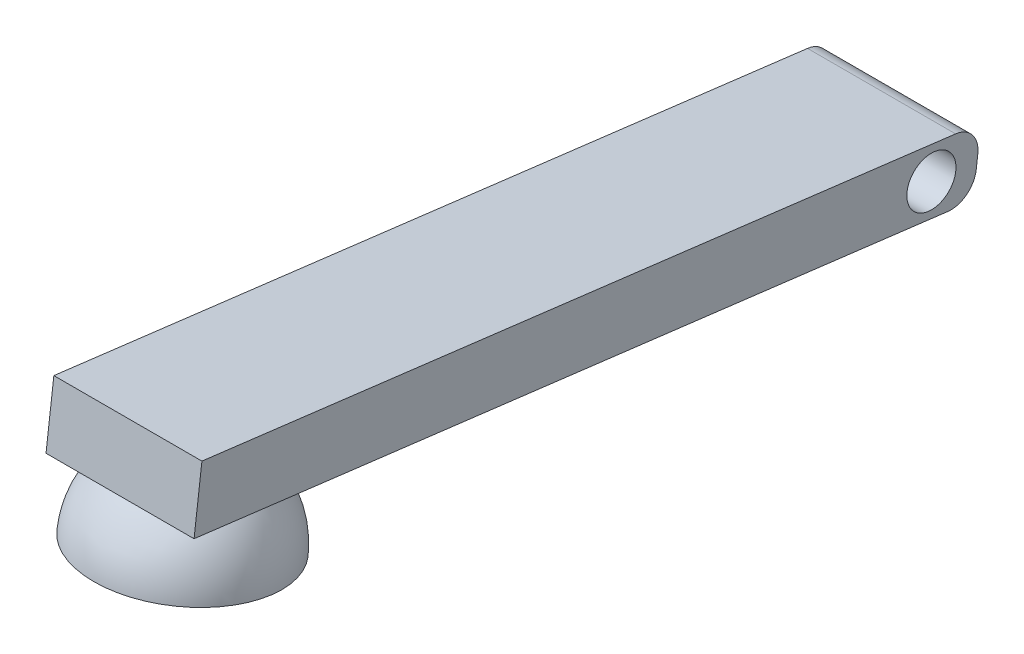
ISO-10303-21;
HEADER;
FILE_DESCRIPTION(('STEP AP214'),'2;1');
FILE_NAME('part.step','',(''),(''),'','','');
FILE_SCHEMA(('AUTOMOTIVE_DESIGN { 1 0 10303 214 1 1 1 1 }'));
ENDSEC;
DATA;
#1=APPLICATION_CONTEXT('core data for automotive mechanical design processes');
#2=APPLICATION_PROTOCOL_DEFINITION('international standard','automotive_design',2000,#1);
#3=PRODUCT_CONTEXT('',#1,'mechanical');
#4=PRODUCT('Part','Part','',(#3));
#5=PRODUCT_RELATED_PRODUCT_CATEGORY('part','',(#4));
#6=PRODUCT_DEFINITION_FORMATION('','',#4);
#7=PRODUCT_DEFINITION_CONTEXT('part definition',#1,'design');
#8=PRODUCT_DEFINITION('design','',#6,#7);
#9=PRODUCT_DEFINITION_SHAPE('','',#8);
#10=(LENGTH_UNIT() NAMED_UNIT(*) SI_UNIT(.MILLI.,.METRE.));
#11=(NAMED_UNIT(*) PLANE_ANGLE_UNIT() SI_UNIT($,.RADIAN.));
#12=(NAMED_UNIT(*) SI_UNIT($,.STERADIAN.) SOLID_ANGLE_UNIT());
#13=UNCERTAINTY_MEASURE_WITH_UNIT(LENGTH_MEASURE(1.E-05),#10,'distance_accuracy_value','');
#14=(GEOMETRIC_REPRESENTATION_CONTEXT(3) GLOBAL_UNCERTAINTY_ASSIGNED_CONTEXT((#13)) GLOBAL_UNIT_ASSIGNED_CONTEXT((#10,
#11,#12)) REPRESENTATION_CONTEXT('',''));
#15=CARTESIAN_POINT('',(0.,0.,0.));
#16=DIRECTION('',(0.,0.,1.));
#17=DIRECTION('',(1.,0.,0.));
#18=AXIS2_PLACEMENT_3D('',#15,#16,#17);
#19=CARTESIAN_POINT('',(-87.5137541739266,3.5780718624892,28.8524545178739));
#20=DIRECTION('',(0.,-0.123069991640094,-0.992397993326119));
#21=DIRECTION('',(0.,0.992397993326119,-0.123069991640094));
#22=AXIS2_PLACEMENT_3D('',#19,#20,#21);
#23=PLANE('',#22);
#24=DIRECTION('',(0.,0.992397993326119,-0.123069991640094));
#25=VECTOR('',#24,1.);
#26=CARTESIAN_POINT('',(-7.366,3.5780718624892,28.8524545178739));
#27=LINE('',#26,#25);
#28=CARTESIAN_POINT('',(-7.366,38.9188420664606,24.4697488667068));
#29=VERTEX_POINT('',#28);
#30=CARTESIAN_POINT('',(-7.366,45.2205693240815,23.6882544197922));
#31=VERTEX_POINT('',#30);
#32=EDGE_CURVE('E134',#29,#31,#27,.T.);
#33=ORIENTED_EDGE('',*,*,#32,.F.);
#34=DIRECTION('',(1.,0.,0.));
#35=VECTOR('',#34,1.);
#36=CARTESIAN_POINT('',(-87.5137541739266,38.9188420664606,24.4697488667068));
#37=LINE('',#36,#35);
#38=CARTESIAN_POINT('',(7.366,38.9188420664606,24.4697488667068));
#39=VERTEX_POINT('',#38);
#40=EDGE_CURVE('E104',#29,#39,#37,.T.);
#41=ORIENTED_EDGE('',*,*,#40,.T.);
#42=DIRECTION('',(0.,0.992397993326119,-0.123069991640094));
#43=VECTOR('',#42,1.);
#44=CARTESIAN_POINT('',(7.366,3.5780718624892,28.8524545178739));
#45=LINE('',#44,#43);
#46=CARTESIAN_POINT('',(7.366,45.2205693240815,23.6882544197922));
#47=VERTEX_POINT('',#46);
#48=EDGE_CURVE('E108',#39,#47,#45,.T.);
#49=ORIENTED_EDGE('',*,*,#48,.T.);
#50=DIRECTION('',(1.,0.,0.));
#51=VECTOR('',#50,1.);
#52=CARTESIAN_POINT('',(-87.5137541739266,45.2205693240815,23.6882544197922));
#53=LINE('',#52,#51);
#54=EDGE_CURVE('E123',#31,#47,#53,.T.);
#55=ORIENTED_EDGE('',*,*,#54,.F.);
#56=EDGE_LOOP('',(#33,#41,#49,#55));
#57=FACE_BOUND('',#56,.T.);
#58=ADVANCED_FACE('F39',(#57),#23,.F.);
#59=CARTESIAN_POINT('',(-87.5137541739266,41.6424974615923,-5.16420009808172));
#60=DIRECTION('',(0.,-0.992397993326118,0.123069991640095));
#61=DIRECTION('',(0.,-0.123069991640095,-0.992397993326119));
#62=AXIS2_PLACEMENT_3D('',#59,#60,#61);
#63=PLANE('',#62);
#64=DIRECTION('',(0.,-0.123069991640095,-0.992397993326119));
#65=VECTOR('',#64,1.);
#66=CARTESIAN_POINT('',(7.366,41.6424974615923,-5.16420009808172));
#67=LINE('',#66,#65);
#68=CARTESIAN_POINT('',(7.366,35.9207854057977,-51.302299945896));
#69=VERTEX_POINT('',#68);
#70=EDGE_CURVE('E121',#47,#69,#67,.T.);
#71=ORIENTED_EDGE('',*,*,#70,.T.);
#72=DIRECTION('',(1.,0.,0.));
#73=VECTOR('',#72,1.);
#74=CARTESIAN_POINT('',(-87.5137541739266,35.9207854057977,-51.302299945896));
#75=LINE('',#74,#73);
#76=CARTESIAN_POINT('',(-7.366,35.9207854057977,-51.302299945896));
#77=VERTEX_POINT('',#76);
#78=EDGE_CURVE('E11',#69,#77,#75,.F.);
#79=ORIENTED_EDGE('',*,*,#78,.T.);
#80=DIRECTION('',(0.,-0.123069991640095,-0.992397993326119));
#81=VECTOR('',#80,1.);
#82=CARTESIAN_POINT('',(-7.366,41.6424974615923,-5.16420009808172));
#83=LINE('',#82,#81);
#84=EDGE_CURVE('E132',#31,#77,#83,.T.);
#85=ORIENTED_EDGE('',*,*,#84,.F.);
#86=ORIENTED_EDGE('',*,*,#54,.T.);
#87=EDGE_LOOP('',(#71,#79,#85,#86));
#88=FACE_BOUND('',#87,.T.);
#89=ADVANCED_FACE('F175',(#88),#63,.F.);
#90=CARTESIAN_POINT('',(-87.5137541739266,-6.03430983456038,-48.6587907508626));
#91=DIRECTION('',(0.,0.123069991640095,0.992397993326118));
#92=DIRECTION('',(0.,-0.992397993326119,0.123069991640095));
#93=AXIS2_PLACEMENT_3D('',#90,#91,#92);
#94=PLANE('',#93);
#95=DIRECTION('',(0.,-0.992397993326119,0.123069991640095));
#96=VECTOR('',#95,1.);
#97=CARTESIAN_POINT('',(7.366,-6.03430983456038,-48.6587907508626));
#98=LINE('',#97,#96);
#99=CARTESIAN_POINT('',(7.366,33.0874967239835,-53.5103930701785));
#100=VERTEX_POINT('',#99);
#101=CARTESIAN_POINT('',(7.366,31.8271512724594,-53.3540941807956));
#102=VERTEX_POINT('',#101);
#103=EDGE_CURVE('E119',#100,#102,#98,.T.);
#104=ORIENTED_EDGE('',*,*,#103,.T.);
#105=DIRECTION('',(1.,0.,0.));
#106=VECTOR('',#105,1.);
#107=CARTESIAN_POINT('',(-87.5137541739266,31.8271512724594,-53.3540941807956));
#108=LINE('',#107,#106);
#109=CARTESIAN_POINT('',(-7.366,31.8271512724594,-53.3540941807956));
#110=VERTEX_POINT('',#109);
#111=EDGE_CURVE('E60',#102,#110,#108,.F.);
#112=ORIENTED_EDGE('',*,*,#111,.T.);
#113=DIRECTION('',(0.,-0.992397993326119,0.123069991640095));
#114=VECTOR('',#113,1.);
#115=CARTESIAN_POINT('',(-7.366,-6.03430983456038,-48.6587907508626));
#116=LINE('',#115,#114);
#117=CARTESIAN_POINT('',(-7.366,33.0874967239835,-53.5103930701785));
#118=VERTEX_POINT('',#117);
#119=EDGE_CURVE('E129',#118,#110,#116,.T.);
#120=ORIENTED_EDGE('',*,*,#119,.F.);
#121=DIRECTION('',(1.,0.,0.));
#122=VECTOR('',#121,1.);
#123=CARTESIAN_POINT('',(-87.5137541739266,33.0874967239835,-53.5103930701785));
#124=LINE('',#123,#122);
#125=EDGE_CURVE('E148',#118,#100,#124,.T.);
#126=ORIENTED_EDGE('',*,*,#125,.T.);
#127=EDGE_LOOP('',(#104,#112,#120,#126));
#128=FACE_BOUND('',#127,.T.);
#129=ADVANCED_FACE('F170',(#128),#94,.F.);
#130=CARTESIAN_POINT('',(-87.5137541739266,35.3407702039715,-4.38270565116708));
#131=DIRECTION('',(0.,0.992397993326119,-0.123069991640094));
#132=DIRECTION('',(0.,0.123069991640094,0.992397993326119));
#133=AXIS2_PLACEMENT_3D('',#130,#131,#132);
#134=PLANE('',#133);
#135=CARTESIAN_POINT('',(0.,38.0517272576209,17.4776057389776));
#136=DIRECTION('',(0.,0.992397993326119,-0.123069991640094));
#137=DIRECTION('',(0.,0.123069991640094,0.992397993326119));
#138=AXIS2_PLACEMENT_3D('',#135,#136,#137);
#139=CIRCLE('',#138,6.22170394666916);
#140=CARTESIAN_POINT('',(0.,38.8174323103246,23.6520122507213));
#141=VERTEX_POINT('',#140);
#142=EDGE_CURVE('E131',#141,#141,#139,.F.);
#143=ORIENTED_EDGE('',*,*,#142,.F.);
#144=EDGE_LOOP('',(#143));
#145=FACE_BOUND('',#144,.T.);
#146=DIRECTION('',(0.,0.123069991640094,0.992397993326119));
#147=VECTOR('',#146,1.);
#148=CARTESIAN_POINT('',(-7.366,35.3407702039715,-4.38270565116708));
#149=LINE('',#148,#147);
#150=CARTESIAN_POINT('',(-7.366,29.6190581481769,-50.5208054989814));
#151=VERTEX_POINT('',#150);
#152=EDGE_CURVE('E128',#151,#29,#149,.T.);
#153=ORIENTED_EDGE('',*,*,#152,.F.);
#154=DIRECTION('',(1.,0.,0.));
#155=VECTOR('',#154,1.);
#156=CARTESIAN_POINT('',(-87.5137541739266,29.6190581481769,-50.5208054989814));
#157=LINE('',#156,#155);
#158=CARTESIAN_POINT('',(7.366,29.619058148177,-50.5208054989814));
#159=VERTEX_POINT('',#158);
#160=EDGE_CURVE('E141',#151,#159,#157,.T.);
#161=ORIENTED_EDGE('',*,*,#160,.T.);
#162=DIRECTION('',(0.,0.123069991640094,0.992397993326119));
#163=VECTOR('',#162,1.);
#164=CARTESIAN_POINT('',(7.366,35.3407702039715,-4.38270565116708));
#165=LINE('',#164,#163);
#166=EDGE_CURVE('E117',#159,#39,#165,.T.);
#167=ORIENTED_EDGE('',*,*,#166,.T.);
#168=ORIENTED_EDGE('',*,*,#40,.F.);
#169=EDGE_LOOP('',(#153,#161,#167,#168));
#170=FACE_BOUND('',#169,.T.);
#171=ADVANCED_FACE('F161',(#145,#170),#134,.F.);
#172=CARTESIAN_POINT('',(-87.5137541739266,33.02,-48.895));
#173=DIRECTION('',(1.,0.,0.));
#174=DIRECTION('',(0.,0.,-1.));
#175=AXIS2_PLACEMENT_3D('',#172,#173,#174);
#176=CYLINDRICAL_SURFACE('',#175,2.44475000000001);
#177=CARTESIAN_POINT('',(7.366,33.02,-48.895));
#178=DIRECTION('',(-1.,0.,0.));
#179=DIRECTION('',(0.,0.,1.));
#180=AXIS2_PLACEMENT_3D('',#177,#178,#179);
#181=CIRCLE('',#180,2.44475000000001);
#182=CARTESIAN_POINT('',(7.366,33.02,-46.45025));
#183=VERTEX_POINT('',#182);
#184=EDGE_CURVE('E113',#183,#183,#181,.F.);
#185=ORIENTED_EDGE('',*,*,#184,.T.);
#186=EDGE_LOOP('',(#185));
#187=FACE_BOUND('',#186,.T.);
#188=CARTESIAN_POINT('',(-7.366,33.02,-48.895));
#189=DIRECTION('',(-1.,0.,0.));
#190=DIRECTION('',(0.,0.,1.));
#191=AXIS2_PLACEMENT_3D('',#188,#189,#190);
#192=CIRCLE('',#191,2.44475000000001);
#193=CARTESIAN_POINT('',(-7.366,33.02,-46.45025));
#194=VERTEX_POINT('',#193);
#195=EDGE_CURVE('E116',#194,#194,#192,.F.);
#196=ORIENTED_EDGE('',*,*,#195,.F.);
#197=EDGE_LOOP('',(#196));
#198=FACE_BOUND('',#197,.T.);
#199=ADVANCED_FACE('F186',(#187,#198),#176,.F.);
#200=CARTESIAN_POINT('',(7.366,0.,0.));
#201=DIRECTION('',(-1.,0.,0.));
#202=DIRECTION('',(0.,0.,1.));
#203=AXIS2_PLACEMENT_3D('',#200,#201,#202);
#204=PLANE('',#203);
#205=ORIENTED_EDGE('',*,*,#166,.F.);
#206=CARTESIAN_POINT('',(7.366,32.1397490512253,-50.8334032777472));
#207=DIRECTION('',(-1.,0.,0.));
#208=DIRECTION('',(0.,0.,1.));
#209=AXIS2_PLACEMENT_3D('',#206,#207,#208);
#210=CIRCLE('',#209,2.54);
#211=EDGE_CURVE('E146',#159,#102,#210,.F.);
#212=ORIENTED_EDGE('',*,*,#211,.T.);
#213=ORIENTED_EDGE('',*,*,#103,.F.);
#214=CARTESIAN_POINT('',(7.366,33.4000945027494,-50.9897021671301));
#215=DIRECTION('',(-1.,0.,0.));
#216=DIRECTION('',(0.,0.,1.));
#217=AXIS2_PLACEMENT_3D('',#214,#215,#216);
#218=CIRCLE('',#217,2.54);
#219=EDGE_CURVE('E144',#100,#69,#218,.F.);
#220=ORIENTED_EDGE('',*,*,#219,.T.);
#221=ORIENTED_EDGE('',*,*,#70,.F.);
#222=ORIENTED_EDGE('',*,*,#48,.F.);
#223=EDGE_LOOP('',(#205,#212,#213,#220,#221,#222));
#224=FACE_BOUND('',#223,.T.);
#225=ORIENTED_EDGE('',*,*,#184,.F.);
#226=EDGE_LOOP('',(#225));
#227=FACE_BOUND('',#226,.T.);
#228=ADVANCED_FACE('F167',(#224,#227),#204,.F.);
#229=CARTESIAN_POINT('',(-7.366,25.4,-49.53));
#230=DIRECTION('',(-1.,0.,0.));
#231=DIRECTION('',(0.,0.,1.));
#232=AXIS2_PLACEMENT_3D('',#229,#230,#231);
#233=PLANE('',#232);
#234=ORIENTED_EDGE('',*,*,#195,.T.);
#235=EDGE_LOOP('',(#234));
#236=FACE_BOUND('',#235,.T.);
#237=ORIENTED_EDGE('',*,*,#119,.T.);
#238=CARTESIAN_POINT('',(-7.366,32.1397490512253,-50.8334032777472));
#239=DIRECTION('',(-1.,0.,0.));
#240=DIRECTION('',(0.,0.,1.));
#241=AXIS2_PLACEMENT_3D('',#238,#239,#240);
#242=CIRCLE('',#241,2.54);
#243=EDGE_CURVE('E47',#110,#151,#242,.T.);
#244=ORIENTED_EDGE('',*,*,#243,.T.);
#245=ORIENTED_EDGE('',*,*,#152,.T.);
#246=ORIENTED_EDGE('',*,*,#32,.T.);
#247=ORIENTED_EDGE('',*,*,#84,.T.);
#248=CARTESIAN_POINT('',(-7.366,33.4000945027494,-50.9897021671301));
#249=DIRECTION('',(-1.,0.,0.));
#250=DIRECTION('',(0.,0.,1.));
#251=AXIS2_PLACEMENT_3D('',#248,#249,#250);
#252=CIRCLE('',#251,2.54);
#253=EDGE_CURVE('E152',#77,#118,#252,.T.);
#254=ORIENTED_EDGE('',*,*,#253,.T.);
#255=EDGE_LOOP('',(#237,#244,#245,#246,#247,#254));
#256=FACE_BOUND('',#255,.T.);
#257=ADVANCED_FACE('F156',(#236,#256),#233,.T.);
#258=CARTESIAN_POINT('',(0.,31.75,18.2591001858922));
#259=DIRECTION('',(0.,-0.992397993326119,0.123069991640095));
#260=DIRECTION('',(0.,0.123069991640095,0.992397993326119));
#261=AXIS2_PLACEMENT_3D('',#258,#259,#260);
#262=SPHERICAL_SURFACE('',#261,8.88999999999992);
#263=CARTESIAN_POINT('',(0.,31.75,18.2591001858922));
#264=DIRECTION('',(0.,-0.992397993326119,0.123069991640095));
#265=DIRECTION('',(0.,-0.123069991640095,-0.992397993326119));
#266=AXIS2_PLACEMENT_3D('',#263,#264,#265);
#267=CIRCLE('',#266,8.88999999999994);
#268=CARTESIAN_POINT('',(0.,30.6559077743196,9.43668202522309));
#269=VERTEX_POINT('',#268);
#270=EDGE_CURVE('E105',#269,#269,#267,.T.);
#271=ORIENTED_EDGE('',*,*,#270,.F.);
#272=EDGE_LOOP('',(#271));
#273=FACE_BOUND('',#272,.T.);
#274=ORIENTED_EDGE('',*,*,#142,.T.);
#275=EDGE_LOOP('',(#274));
#276=FACE_BOUND('',#275,.T.);
#277=ADVANCED_FACE('F98',(#273,#276),#262,.T.);
#278=CARTESIAN_POINT('',(0.,31.75,18.2591001858922));
#279=DIRECTION('',(0.,-0.992397993326119,0.123069991640095));
#280=DIRECTION('',(0.,-0.123069991640095,-0.992397993326119));
#281=AXIS2_PLACEMENT_3D('',#278,#279,#280);
#282=SPHERICAL_SURFACE('',#281,6.34999999999993);
#283=CARTESIAN_POINT('',(0.,38.0517272576208,17.4776057389776));
#284=VERTEX_POINT('',#283);
#285=VERTEX_LOOP('',#284);
#286=FACE_BOUND('',#285,.T.);
#287=CARTESIAN_POINT('',(0.,31.75,18.2591001858922));
#288=DIRECTION('',(0.,-0.992397993326119,0.123069991640095));
#289=DIRECTION('',(0.,-0.123069991640095,-0.992397993326119));
#290=AXIS2_PLACEMENT_3D('',#287,#288,#289);
#291=CIRCLE('',#290,6.34999999999994);
#292=CARTESIAN_POINT('',(0.,30.9685055530854,11.9573729282714));
#293=VERTEX_POINT('',#292);
#294=EDGE_CURVE('E102',#293,#293,#291,.T.);
#295=ORIENTED_EDGE('',*,*,#294,.T.);
#296=EDGE_LOOP('',(#295));
#297=FACE_BOUND('',#296,.T.);
#298=ADVANCED_FACE('F94',(#286,#297),#282,.F.);
#299=CARTESIAN_POINT('',(0.,30.6559077743196,9.4366820252231));
#300=DIRECTION('',(0.,0.992397993326119,-0.123069991640095));
#301=DIRECTION('',(0.,0.123069991640095,0.992397993326119));
#302=AXIS2_PLACEMENT_3D('',#299,#300,#301);
#303=PLANE('',#302);
#304=ORIENTED_EDGE('',*,*,#294,.F.);
#305=EDGE_LOOP('',(#304));
#306=FACE_BOUND('',#305,.T.);
#307=ORIENTED_EDGE('',*,*,#270,.T.);
#308=EDGE_LOOP('',(#307));
#309=FACE_BOUND('',#308,.T.);
#310=ADVANCED_FACE('F97',(#306,#309),#303,.F.);
#311=CARTESIAN_POINT('',(-87.5137541739266,32.1397490512253,-50.8334032777472));
#312=DIRECTION('',(1.,0.,0.));
#313=DIRECTION('',(0.,0.,-1.));
#314=AXIS2_PLACEMENT_3D('',#311,#312,#313);
#315=CYLINDRICAL_SURFACE('',#314,2.54);
#316=ORIENTED_EDGE('',*,*,#243,.F.);
#317=ORIENTED_EDGE('',*,*,#111,.F.);
#318=ORIENTED_EDGE('',*,*,#211,.F.);
#319=ORIENTED_EDGE('',*,*,#160,.F.);
#320=EDGE_LOOP('',(#316,#317,#318,#319));
#321=FACE_BOUND('',#320,.T.);
#322=ADVANCED_FACE('F164',(#321),#315,.T.);
#323=CARTESIAN_POINT('',(-87.5137541739266,33.4000945027494,-50.9897021671301));
#324=DIRECTION('',(1.,0.,0.));
#325=DIRECTION('',(0.,0.,-1.));
#326=AXIS2_PLACEMENT_3D('',#323,#324,#325);
#327=CYLINDRICAL_SURFACE('',#326,2.54);
#328=ORIENTED_EDGE('',*,*,#253,.F.);
#329=ORIENTED_EDGE('',*,*,#78,.F.);
#330=ORIENTED_EDGE('',*,*,#219,.F.);
#331=ORIENTED_EDGE('',*,*,#125,.F.);
#332=EDGE_LOOP('',(#328,#329,#330,#331));
#333=FACE_BOUND('',#332,.T.);
#334=ADVANCED_FACE('F41',(#333),#327,.T.);
#335=CLOSED_SHELL('',(#58,#89,#129,#171,#199,#228,#257,#277,#298,#310,#322,#334));
#336=MANIFOLD_SOLID_BREP('B2',#335);
#337=ADVANCED_BREP_SHAPE_REPRESENTATION('',(#18,#336),#14);
#338=SHAPE_DEFINITION_REPRESENTATION(#9,#337);
ENDSEC;
END-ISO-10303-21;
